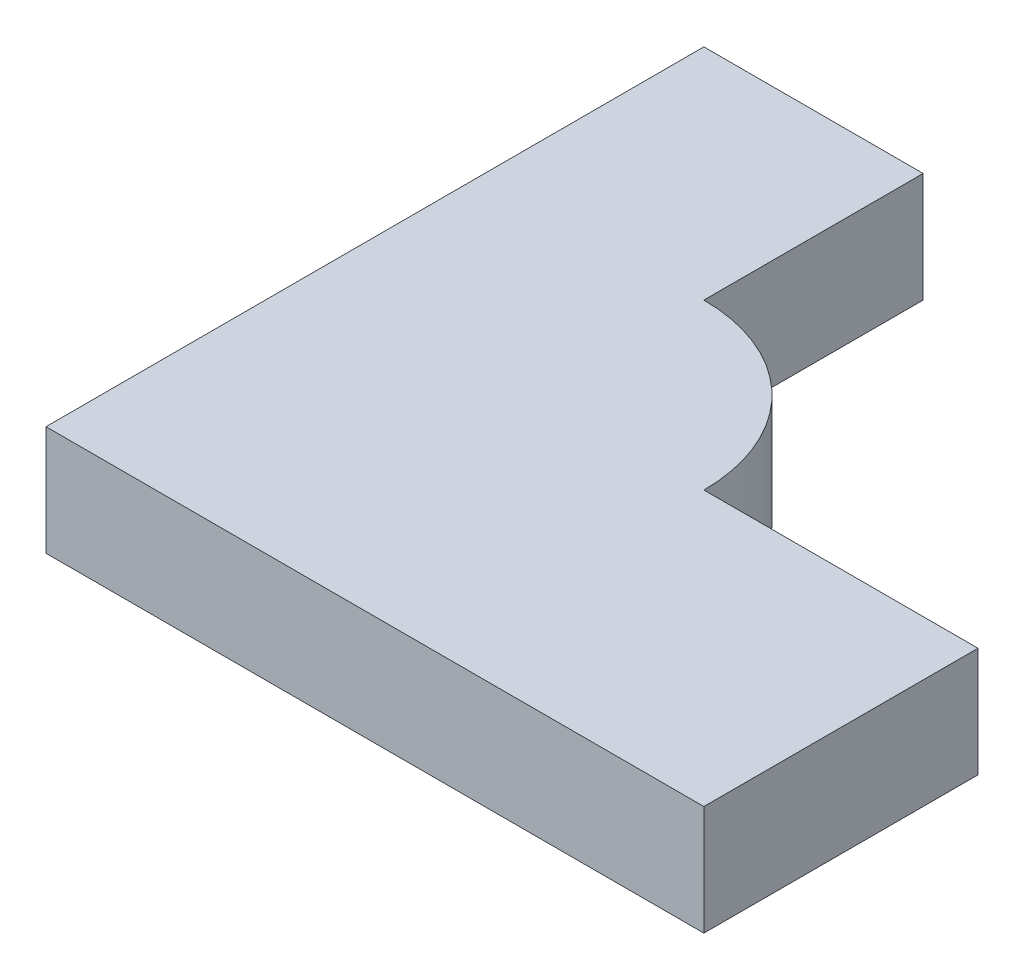
ISO-10303-21;
HEADER;
FILE_DESCRIPTION(('STEP AP214'),'2;1');
FILE_NAME('part.step','',(''),(''),'','','');
FILE_SCHEMA(('AUTOMOTIVE_DESIGN { 1 0 10303 214 1 1 1 1 }'));
ENDSEC;
DATA;
#1=APPLICATION_CONTEXT('core data for automotive mechanical design processes');
#2=APPLICATION_PROTOCOL_DEFINITION('international standard','automotive_design',2000,#1);
#3=PRODUCT_CONTEXT('',#1,'mechanical');
#4=PRODUCT('Part','Part','',(#3));
#5=PRODUCT_RELATED_PRODUCT_CATEGORY('part','',(#4));
#6=PRODUCT_DEFINITION_FORMATION('','',#4);
#7=PRODUCT_DEFINITION_CONTEXT('part definition',#1,'design');
#8=PRODUCT_DEFINITION('design','',#6,#7);
#9=PRODUCT_DEFINITION_SHAPE('','',#8);
#10=(LENGTH_UNIT() NAMED_UNIT(*) SI_UNIT(.MILLI.,.METRE.));
#11=(NAMED_UNIT(*) PLANE_ANGLE_UNIT() SI_UNIT($,.RADIAN.));
#12=(NAMED_UNIT(*) SI_UNIT($,.STERADIAN.) SOLID_ANGLE_UNIT());
#13=UNCERTAINTY_MEASURE_WITH_UNIT(LENGTH_MEASURE(1.E-05),#10,'distance_accuracy_value','');
#14=(GEOMETRIC_REPRESENTATION_CONTEXT(3) GLOBAL_UNCERTAINTY_ASSIGNED_CONTEXT((#13)) GLOBAL_UNIT_ASSIGNED_CONTEXT((#10,
#11,#12)) REPRESENTATION_CONTEXT('',''));
#15=CARTESIAN_POINT('',(0.,0.,0.));
#16=DIRECTION('',(0.,0.,1.));
#17=DIRECTION('',(1.,0.,0.));
#18=AXIS2_PLACEMENT_3D('',#15,#16,#17);
#19=CARTESIAN_POINT('',(0.,10.,-60.));
#20=DIRECTION('',(1.,0.,0.));
#21=DIRECTION('',(0.,0.,-1.));
#22=AXIS2_PLACEMENT_3D('',#19,#20,#21);
#23=PLANE('',#22);
#24=DIRECTION('',(0.,0.,1.));
#25=VECTOR('',#24,1.);
#26=CARTESIAN_POINT('',(0.,0.,-60.));
#27=LINE('',#26,#25);
#28=CARTESIAN_POINT('',(0.,0.,-60.));
#29=VERTEX_POINT('',#28);
#30=CARTESIAN_POINT('',(0.,0.,0.));
#31=VERTEX_POINT('',#30);
#32=EDGE_CURVE('E129',#29,#31,#27,.T.);
#33=ORIENTED_EDGE('',*,*,#32,.T.);
#34=DIRECTION('',(0.,-1.,0.));
#35=VECTOR('',#34,1.);
#36=CARTESIAN_POINT('',(0.,10.,0.));
#37=LINE('',#36,#35);
#38=CARTESIAN_POINT('',(0.,10.,0.));
#39=VERTEX_POINT('',#38);
#40=EDGE_CURVE('E11',#39,#31,#37,.T.);
#41=ORIENTED_EDGE('',*,*,#40,.F.);
#42=DIRECTION('',(0.,0.,1.));
#43=VECTOR('',#42,1.);
#44=CARTESIAN_POINT('',(0.,10.,-60.));
#45=LINE('',#44,#43);
#46=CARTESIAN_POINT('',(0.,10.,-60.));
#47=VERTEX_POINT('',#46);
#48=EDGE_CURVE('E141',#47,#39,#45,.T.);
#49=ORIENTED_EDGE('',*,*,#48,.F.);
#50=DIRECTION('',(0.,-1.,0.));
#51=VECTOR('',#50,1.);
#52=CARTESIAN_POINT('',(0.,10.,-60.));
#53=LINE('',#52,#51);
#54=EDGE_CURVE('E124',#47,#29,#53,.T.);
#55=ORIENTED_EDGE('',*,*,#54,.T.);
#56=EDGE_LOOP('',(#33,#41,#49,#55));
#57=FACE_BOUND('',#56,.T.);
#58=ADVANCED_FACE('F39',(#57),#23,.F.);
#59=CARTESIAN_POINT('',(0.,10.,0.));
#60=DIRECTION('',(0.,0.,-1.));
#61=DIRECTION('',(-1.,0.,0.));
#62=AXIS2_PLACEMENT_3D('',#59,#60,#61);
#63=PLANE('',#62);
#64=DIRECTION('',(1.,0.,0.));
#65=VECTOR('',#64,1.);
#66=CARTESIAN_POINT('',(0.,0.,0.));
#67=LINE('',#66,#65);
#68=CARTESIAN_POINT('',(60.,0.,0.));
#69=VERTEX_POINT('',#68);
#70=EDGE_CURVE('E135',#31,#69,#67,.T.);
#71=ORIENTED_EDGE('',*,*,#70,.T.);
#72=DIRECTION('',(0.,-1.,0.));
#73=VECTOR('',#72,1.);
#74=CARTESIAN_POINT('',(60.,10.,0.));
#75=LINE('',#74,#73);
#76=CARTESIAN_POINT('',(60.,10.,0.));
#77=VERTEX_POINT('',#76);
#78=EDGE_CURVE('E50',#77,#69,#75,.T.);
#79=ORIENTED_EDGE('',*,*,#78,.F.);
#80=DIRECTION('',(1.,0.,0.));
#81=VECTOR('',#80,1.);
#82=CARTESIAN_POINT('',(0.,10.,0.));
#83=LINE('',#82,#81);
#84=EDGE_CURVE('E94',#39,#77,#83,.T.);
#85=ORIENTED_EDGE('',*,*,#84,.F.);
#86=ORIENTED_EDGE('',*,*,#40,.T.);
#87=EDGE_LOOP('',(#71,#79,#85,#86));
#88=FACE_BOUND('',#87,.T.);
#89=ADVANCED_FACE('F168',(#88),#63,.F.);
#90=CARTESIAN_POINT('',(60.,10.,0.));
#91=DIRECTION('',(-1.,0.,0.));
#92=DIRECTION('',(0.,0.,1.));
#93=AXIS2_PLACEMENT_3D('',#90,#91,#92);
#94=PLANE('',#93);
#95=DIRECTION('',(0.,0.,-1.));
#96=VECTOR('',#95,1.);
#97=CARTESIAN_POINT('',(60.,0.,0.));
#98=LINE('',#97,#96);
#99=CARTESIAN_POINT('',(60.,0.,-25.));
#100=VERTEX_POINT('',#99);
#101=EDGE_CURVE('E132',#69,#100,#98,.T.);
#102=ORIENTED_EDGE('',*,*,#101,.T.);
#103=DIRECTION('',(0.,-1.,0.));
#104=VECTOR('',#103,1.);
#105=CARTESIAN_POINT('',(60.,10.,-25.));
#106=LINE('',#105,#104);
#107=CARTESIAN_POINT('',(60.,10.,-25.));
#108=VERTEX_POINT('',#107);
#109=EDGE_CURVE('E144',#108,#100,#106,.T.);
#110=ORIENTED_EDGE('',*,*,#109,.F.);
#111=DIRECTION('',(0.,0.,-1.));
#112=VECTOR('',#111,1.);
#113=CARTESIAN_POINT('',(60.,10.,0.));
#114=LINE('',#113,#112);
#115=EDGE_CURVE('E154',#77,#108,#114,.T.);
#116=ORIENTED_EDGE('',*,*,#115,.F.);
#117=ORIENTED_EDGE('',*,*,#78,.T.);
#118=EDGE_LOOP('',(#102,#110,#116,#117));
#119=FACE_BOUND('',#118,.T.);
#120=ADVANCED_FACE('F151',(#119),#94,.F.);
#121=CARTESIAN_POINT('',(60.,10.,-25.));
#122=DIRECTION('',(0.,0.,1.));
#123=DIRECTION('',(1.,0.,0.));
#124=AXIS2_PLACEMENT_3D('',#121,#122,#123);
#125=PLANE('',#124);
#126=DIRECTION('',(-1.,0.,0.));
#127=VECTOR('',#126,1.);
#128=CARTESIAN_POINT('',(60.,0.,-25.));
#129=LINE('',#128,#127);
#130=CARTESIAN_POINT('',(35.,0.,-25.));
#131=VERTEX_POINT('',#130);
#132=EDGE_CURVE('E136',#100,#131,#129,.T.);
#133=ORIENTED_EDGE('',*,*,#132,.T.);
#134=DIRECTION('',(0.,-1.,0.));
#135=VECTOR('',#134,1.);
#136=CARTESIAN_POINT('',(35.,10.,-25.));
#137=LINE('',#136,#135);
#138=CARTESIAN_POINT('',(35.,10.,-25.));
#139=VERTEX_POINT('',#138);
#140=EDGE_CURVE('E120',#139,#131,#137,.T.);
#141=ORIENTED_EDGE('',*,*,#140,.F.);
#142=DIRECTION('',(-1.,0.,0.));
#143=VECTOR('',#142,1.);
#144=CARTESIAN_POINT('',(60.,10.,-25.));
#145=LINE('',#144,#143);
#146=EDGE_CURVE('E112',#108,#139,#145,.T.);
#147=ORIENTED_EDGE('',*,*,#146,.F.);
#148=ORIENTED_EDGE('',*,*,#109,.T.);
#149=EDGE_LOOP('',(#133,#141,#147,#148));
#150=FACE_BOUND('',#149,.T.);
#151=ADVANCED_FACE('F159',(#150),#125,.F.);
#152=CARTESIAN_POINT('',(20.,10.,-25.));
#153=DIRECTION('',(0.,-1.,0.));
#154=DIRECTION('',(0.,0.,-1.));
#155=AXIS2_PLACEMENT_3D('',#152,#153,#154);
#156=CYLINDRICAL_SURFACE('',#155,15.);
#157=CARTESIAN_POINT('',(20.,0.,-25.));
#158=DIRECTION('',(0.,1.,0.));
#159=DIRECTION('',(0.,0.,1.));
#160=AXIS2_PLACEMENT_3D('',#157,#158,#159);
#161=CIRCLE('',#160,15.);
#162=CARTESIAN_POINT('',(20.,0.,-40.));
#163=VERTEX_POINT('',#162);
#164=EDGE_CURVE('E118',#131,#163,#161,.T.);
#165=ORIENTED_EDGE('',*,*,#164,.T.);
#166=DIRECTION('',(0.,-1.,0.));
#167=VECTOR('',#166,1.);
#168=CARTESIAN_POINT('',(20.,10.,-40.));
#169=LINE('',#168,#167);
#170=CARTESIAN_POINT('',(20.,10.,-40.));
#171=VERTEX_POINT('',#170);
#172=EDGE_CURVE('E116',#171,#163,#169,.T.);
#173=ORIENTED_EDGE('',*,*,#172,.F.);
#174=CARTESIAN_POINT('',(20.,10.,-25.));
#175=DIRECTION('',(0.,1.,0.));
#176=DIRECTION('',(0.,0.,1.));
#177=AXIS2_PLACEMENT_3D('',#174,#175,#176);
#178=CIRCLE('',#177,15.);
#179=EDGE_CURVE('E103',#139,#171,#178,.T.);
#180=ORIENTED_EDGE('',*,*,#179,.F.);
#181=ORIENTED_EDGE('',*,*,#140,.T.);
#182=EDGE_LOOP('',(#165,#173,#180,#181));
#183=FACE_BOUND('',#182,.T.);
#184=ADVANCED_FACE('F117',(#183),#156,.T.);
#185=CARTESIAN_POINT('',(20.,10.,-40.));
#186=DIRECTION('',(-1.,0.,0.));
#187=DIRECTION('',(0.,0.,1.));
#188=AXIS2_PLACEMENT_3D('',#185,#186,#187);
#189=PLANE('',#188);
#190=DIRECTION('',(0.,0.,-1.));
#191=VECTOR('',#190,1.);
#192=CARTESIAN_POINT('',(20.,0.,-40.));
#193=LINE('',#192,#191);
#194=CARTESIAN_POINT('',(20.,0.,-60.));
#195=VERTEX_POINT('',#194);
#196=EDGE_CURVE('E83',#163,#195,#193,.T.);
#197=ORIENTED_EDGE('',*,*,#196,.T.);
#198=DIRECTION('',(0.,-1.,0.));
#199=VECTOR('',#198,1.);
#200=CARTESIAN_POINT('',(20.,10.,-60.));
#201=LINE('',#200,#199);
#202=CARTESIAN_POINT('',(20.,10.,-60.));
#203=VERTEX_POINT('',#202);
#204=EDGE_CURVE('E123',#203,#195,#201,.T.);
#205=ORIENTED_EDGE('',*,*,#204,.F.);
#206=DIRECTION('',(0.,0.,-1.));
#207=VECTOR('',#206,1.);
#208=CARTESIAN_POINT('',(20.,10.,-40.));
#209=LINE('',#208,#207);
#210=EDGE_CURVE('E108',#171,#203,#209,.T.);
#211=ORIENTED_EDGE('',*,*,#210,.F.);
#212=ORIENTED_EDGE('',*,*,#172,.T.);
#213=EDGE_LOOP('',(#197,#205,#211,#212));
#214=FACE_BOUND('',#213,.T.);
#215=ADVANCED_FACE('F121',(#214),#189,.F.);
#216=CARTESIAN_POINT('',(20.,10.,-60.));
#217=DIRECTION('',(0.,0.,1.));
#218=DIRECTION('',(1.,0.,0.));
#219=AXIS2_PLACEMENT_3D('',#216,#217,#218);
#220=PLANE('',#219);
#221=DIRECTION('',(-1.,0.,0.));
#222=VECTOR('',#221,1.);
#223=CARTESIAN_POINT('',(20.,0.,-60.));
#224=LINE('',#223,#222);
#225=EDGE_CURVE('E90',#195,#29,#224,.T.);
#226=ORIENTED_EDGE('',*,*,#225,.T.);
#227=ORIENTED_EDGE('',*,*,#54,.F.);
#228=DIRECTION('',(-1.,0.,0.));
#229=VECTOR('',#228,1.);
#230=CARTESIAN_POINT('',(20.,10.,-60.));
#231=LINE('',#230,#229);
#232=EDGE_CURVE('E54',#203,#47,#231,.T.);
#233=ORIENTED_EDGE('',*,*,#232,.F.);
#234=ORIENTED_EDGE('',*,*,#204,.T.);
#235=EDGE_LOOP('',(#226,#227,#233,#234));
#236=FACE_BOUND('',#235,.T.);
#237=ADVANCED_FACE('F179',(#236),#220,.F.);
#238=CARTESIAN_POINT('',(20.,10.,-25.));
#239=DIRECTION('',(0.,1.,0.));
#240=DIRECTION('',(0.,0.,1.));
#241=AXIS2_PLACEMENT_3D('',#238,#239,#240);
#242=PLANE('',#241);
#243=ORIENTED_EDGE('',*,*,#48,.T.);
#244=ORIENTED_EDGE('',*,*,#84,.T.);
#245=ORIENTED_EDGE('',*,*,#115,.T.);
#246=ORIENTED_EDGE('',*,*,#146,.T.);
#247=ORIENTED_EDGE('',*,*,#179,.T.);
#248=ORIENTED_EDGE('',*,*,#210,.T.);
#249=ORIENTED_EDGE('',*,*,#232,.T.);
#250=EDGE_LOOP('',(#243,#244,#245,#246,#247,#248,#249));
#251=FACE_BOUND('',#250,.T.);
#252=ADVANCED_FACE('F107',(#251),#242,.T.);
#253=CARTESIAN_POINT('',(20.,0.,-25.));
#254=DIRECTION('',(0.,1.,0.));
#255=DIRECTION('',(0.,0.,1.));
#256=AXIS2_PLACEMENT_3D('',#253,#254,#255);
#257=PLANE('',#256);
#258=ORIENTED_EDGE('',*,*,#32,.F.);
#259=ORIENTED_EDGE('',*,*,#225,.F.);
#260=ORIENTED_EDGE('',*,*,#196,.F.);
#261=ORIENTED_EDGE('',*,*,#164,.F.);
#262=ORIENTED_EDGE('',*,*,#132,.F.);
#263=ORIENTED_EDGE('',*,*,#101,.F.);
#264=ORIENTED_EDGE('',*,*,#70,.F.);
#265=EDGE_LOOP('',(#258,#259,#260,#261,#262,#263,#264));
#266=FACE_BOUND('',#265,.T.);
#267=ADVANCED_FACE('F160',(#266),#257,.F.);
#268=CLOSED_SHELL('',(#58,#89,#120,#151,#184,#215,#237,#252,#267));
#269=MANIFOLD_SOLID_BREP('B2',#268);
#270=ADVANCED_BREP_SHAPE_REPRESENTATION('',(#18,#269),#14);
#271=SHAPE_DEFINITION_REPRESENTATION(#9,#270);
ENDSEC;
END-ISO-10303-21;
